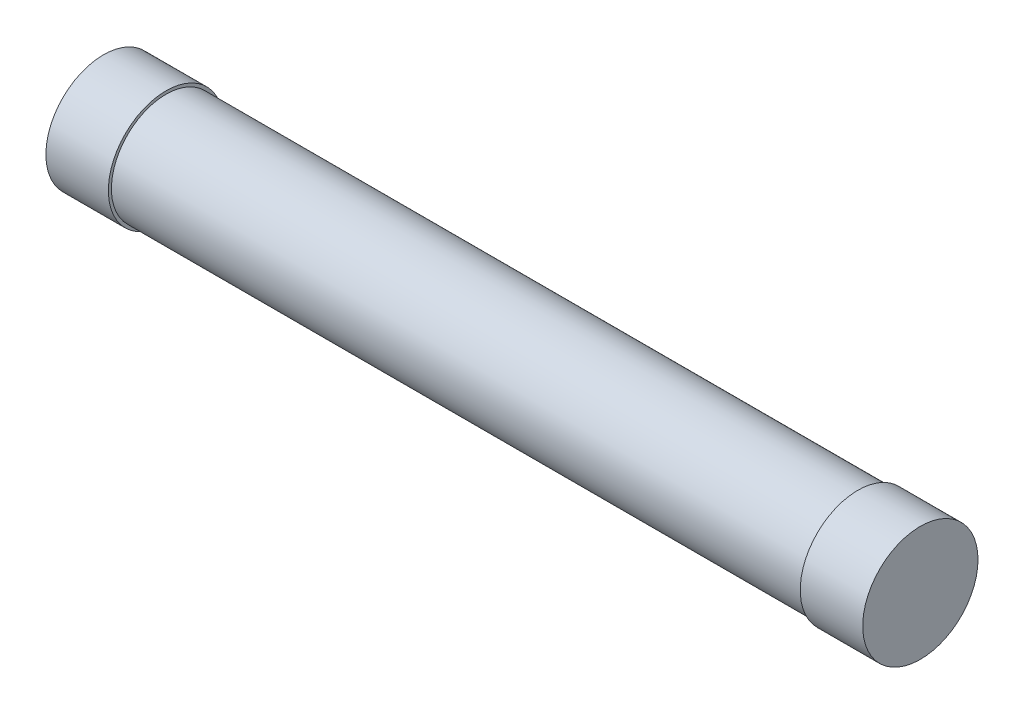
ISO-10303-21;
HEADER;
FILE_DESCRIPTION(('STEP AP214'),'2;1');
FILE_NAME('part.step','',(''),(''),'','','');
FILE_SCHEMA(('AUTOMOTIVE_DESIGN { 1 0 10303 214 1 1 1 1 }'));
ENDSEC;
DATA;
#1=APPLICATION_CONTEXT('core data for automotive mechanical design processes');
#2=APPLICATION_PROTOCOL_DEFINITION('international standard','automotive_design',2000,#1);
#3=PRODUCT_CONTEXT('',#1,'mechanical');
#4=PRODUCT('Part','Part','',(#3));
#5=PRODUCT_RELATED_PRODUCT_CATEGORY('part','',(#4));
#6=PRODUCT_DEFINITION_FORMATION('','',#4);
#7=PRODUCT_DEFINITION_CONTEXT('part definition',#1,'design');
#8=PRODUCT_DEFINITION('design','',#6,#7);
#9=PRODUCT_DEFINITION_SHAPE('','',#8);
#10=(LENGTH_UNIT() NAMED_UNIT(*) SI_UNIT(.MILLI.,.METRE.));
#11=(NAMED_UNIT(*) PLANE_ANGLE_UNIT() SI_UNIT($,.RADIAN.));
#12=(NAMED_UNIT(*) SI_UNIT($,.STERADIAN.) SOLID_ANGLE_UNIT());
#13=UNCERTAINTY_MEASURE_WITH_UNIT(LENGTH_MEASURE(1.E-05),#10,'distance_accuracy_value','');
#14=(GEOMETRIC_REPRESENTATION_CONTEXT(3) GLOBAL_UNCERTAINTY_ASSIGNED_CONTEXT((#13)) GLOBAL_UNIT_ASSIGNED_CONTEXT((#10,
#11,#12)) REPRESENTATION_CONTEXT('',''));
#15=CARTESIAN_POINT('',(0.,0.,0.));
#16=DIRECTION('',(0.,0.,1.));
#17=DIRECTION('',(1.,0.,0.));
#18=AXIS2_PLACEMENT_3D('',#15,#16,#17);
#19=CARTESIAN_POINT('',(67.46875,0.,0.));
#20=DIRECTION('',(-1.,0.,0.));
#21=DIRECTION('',(0.,0.,1.));
#22=AXIS2_PLACEMENT_3D('',#19,#20,#21);
#23=CYLINDRICAL_SURFACE('',#22,9.525);
#24=CARTESIAN_POINT('',(-67.46875,0.,0.));
#25=DIRECTION('',(1.,0.,0.));
#26=DIRECTION('',(0.,0.,-1.));
#27=AXIS2_PLACEMENT_3D('',#24,#25,#26);
#28=CIRCLE('',#27,9.525);
#29=CARTESIAN_POINT('',(-67.46875,0.,-9.525));
#30=VERTEX_POINT('',#29);
#31=EDGE_CURVE('E35',#30,#30,#28,.T.);
#32=ORIENTED_EDGE('',*,*,#31,.T.);
#33=EDGE_LOOP('',(#32));
#34=FACE_BOUND('',#33,.T.);
#35=CARTESIAN_POINT('',(-57.15,0.,0.));
#36=DIRECTION('',(1.,0.,0.));
#37=DIRECTION('',(0.,0.,-1.));
#38=AXIS2_PLACEMENT_3D('',#35,#36,#37);
#39=CIRCLE('',#38,9.525);
#40=CARTESIAN_POINT('',(-57.15,0.,-9.525));
#41=VERTEX_POINT('',#40);
#42=EDGE_CURVE('E42',#41,#41,#39,.T.);
#43=ORIENTED_EDGE('',*,*,#42,.F.);
#44=EDGE_LOOP('',(#43));
#45=FACE_BOUND('',#44,.T.);
#46=ADVANCED_FACE('F31',(#34,#45),#23,.T.);
#47=CARTESIAN_POINT('',(-67.46875,0.,0.));
#48=DIRECTION('',(1.,0.,0.));
#49=DIRECTION('',(0.,0.,-1.));
#50=AXIS2_PLACEMENT_3D('',#47,#48,#49);
#51=PLANE('',#50);
#52=ORIENTED_EDGE('',*,*,#31,.F.);
#53=EDGE_LOOP('',(#52));
#54=FACE_BOUND('',#53,.T.);
#55=ADVANCED_FACE('F63',(#54),#51,.F.);
#56=CARTESIAN_POINT('',(-57.15,0.,0.));
#57=DIRECTION('',(1.,0.,0.));
#58=DIRECTION('',(0.,0.,-1.));
#59=AXIS2_PLACEMENT_3D('',#56,#57,#58);
#60=PLANE('',#59);
#61=CARTESIAN_POINT('',(-57.15,0.,0.));
#62=DIRECTION('',(1.,0.,0.));
#63=DIRECTION('',(0.,0.,-1.));
#64=AXIS2_PLACEMENT_3D('',#61,#62,#63);
#65=CIRCLE('',#64,9.025);
#66=CARTESIAN_POINT('',(-57.15,0.,-9.025));
#67=VERTEX_POINT('',#66);
#68=EDGE_CURVE('E47',#67,#67,#65,.T.);
#69=ORIENTED_EDGE('',*,*,#68,.F.);
#70=EDGE_LOOP('',(#69));
#71=FACE_BOUND('',#70,.T.);
#72=ORIENTED_EDGE('',*,*,#42,.T.);
#73=EDGE_LOOP('',(#72));
#74=FACE_BOUND('',#73,.T.);
#75=ADVANCED_FACE('F59',(#71,#74),#60,.T.);
#76=CARTESIAN_POINT('',(57.15,0.,0.));
#77=DIRECTION('',(1.,0.,0.));
#78=DIRECTION('',(0.,0.,-1.));
#79=AXIS2_PLACEMENT_3D('',#76,#77,#78);
#80=PLANE('',#79);
#81=CARTESIAN_POINT('',(57.15,0.,0.));
#82=DIRECTION('',(1.,0.,0.));
#83=DIRECTION('',(0.,0.,-1.));
#84=AXIS2_PLACEMENT_3D('',#81,#82,#83);
#85=CIRCLE('',#84,9.025);
#86=CARTESIAN_POINT('',(57.15,0.,-9.025));
#87=VERTEX_POINT('',#86);
#88=EDGE_CURVE('E50',#87,#87,#85,.T.);
#89=ORIENTED_EDGE('',*,*,#88,.T.);
#90=EDGE_LOOP('',(#89));
#91=FACE_BOUND('',#90,.T.);
#92=CARTESIAN_POINT('',(57.15,0.,0.));
#93=DIRECTION('',(1.,0.,0.));
#94=DIRECTION('',(0.,0.,-1.));
#95=AXIS2_PLACEMENT_3D('',#92,#93,#94);
#96=CIRCLE('',#95,9.525);
#97=CARTESIAN_POINT('',(57.15,0.,-9.525));
#98=VERTEX_POINT('',#97);
#99=EDGE_CURVE('E44',#98,#98,#96,.T.);
#100=ORIENTED_EDGE('',*,*,#99,.F.);
#101=EDGE_LOOP('',(#100));
#102=FACE_BOUND('',#101,.T.);
#103=ADVANCED_FACE('F62',(#91,#102),#80,.F.);
#104=CARTESIAN_POINT('',(-57.15,0.,0.));
#105=DIRECTION('',(1.,0.,0.));
#106=DIRECTION('',(0.,0.,-1.));
#107=AXIS2_PLACEMENT_3D('',#104,#105,#106);
#108=CYLINDRICAL_SURFACE('',#107,9.025);
#109=ORIENTED_EDGE('',*,*,#68,.T.);
#110=EDGE_LOOP('',(#109));
#111=FACE_BOUND('',#110,.T.);
#112=ORIENTED_EDGE('',*,*,#88,.F.);
#113=EDGE_LOOP('',(#112));
#114=FACE_BOUND('',#113,.T.);
#115=ADVANCED_FACE('F56',(#111,#114),#108,.T.);
#116=CARTESIAN_POINT('',(67.46875,0.,0.));
#117=DIRECTION('',(1.,0.,0.));
#118=DIRECTION('',(0.,0.,-1.));
#119=AXIS2_PLACEMENT_3D('',#116,#117,#118);
#120=PLANE('',#119);
#121=CARTESIAN_POINT('',(67.46875,0.,0.));
#122=DIRECTION('',(1.,0.,0.));
#123=DIRECTION('',(0.,0.,-1.));
#124=AXIS2_PLACEMENT_3D('',#121,#122,#123);
#125=CIRCLE('',#124,9.525);
#126=CARTESIAN_POINT('',(67.46875,0.,-9.525));
#127=VERTEX_POINT('',#126);
#128=EDGE_CURVE('E10',#127,#127,#125,.T.);
#129=ORIENTED_EDGE('',*,*,#128,.T.);
#130=EDGE_LOOP('',(#129));
#131=FACE_BOUND('',#130,.T.);
#132=ADVANCED_FACE('F74',(#131),#120,.T.);
#133=ORIENTED_EDGE('',*,*,#99,.T.);
#134=EDGE_LOOP('',(#133));
#135=FACE_BOUND('',#134,.T.);
#136=ORIENTED_EDGE('',*,*,#128,.F.);
#137=EDGE_LOOP('',(#136));
#138=FACE_BOUND('',#137,.T.);
#139=ADVANCED_FACE('F33',(#135,#138),#23,.T.);
#140=CLOSED_SHELL('',(#46,#55,#75,#103,#115,#132,#139));
#141=MANIFOLD_SOLID_BREP('B2',#140);
#142=ADVANCED_BREP_SHAPE_REPRESENTATION('',(#18,#141),#14);
#143=SHAPE_DEFINITION_REPRESENTATION(#9,#142);
ENDSEC;
END-ISO-10303-21;
